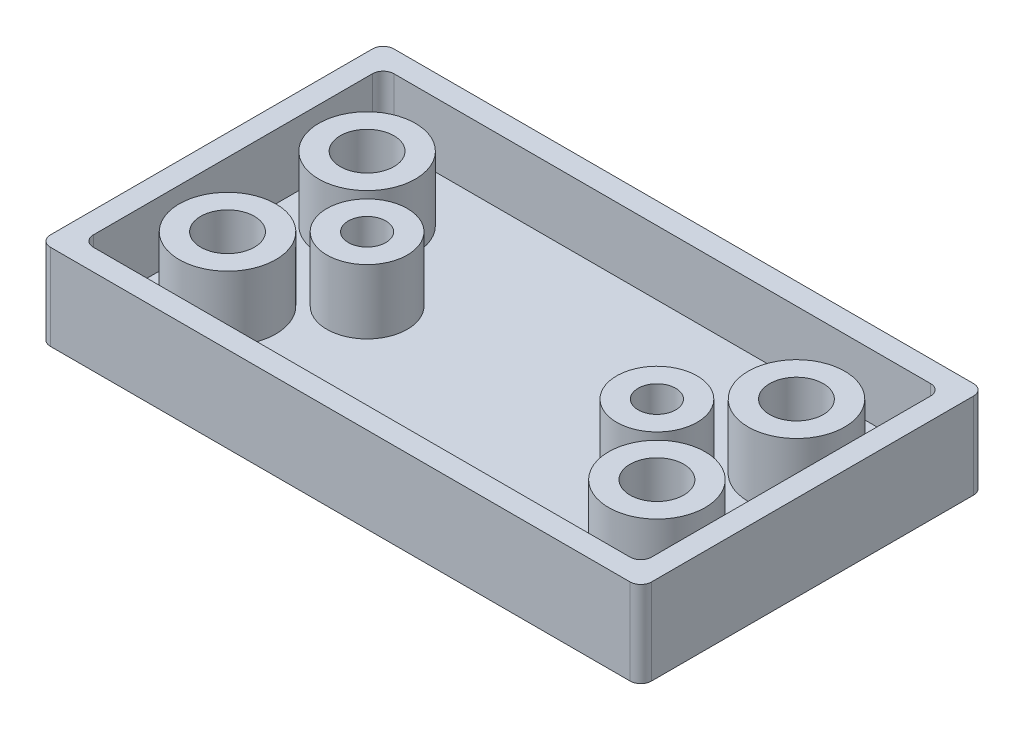
ISO-10303-21;
HEADER;
FILE_DESCRIPTION(('STEP AP214'),'2;1');
FILE_NAME('part.step','',(''),(''),'','','');
FILE_SCHEMA(('AUTOMOTIVE_DESIGN { 1 0 10303 214 1 1 1 1 }'));
ENDSEC;
DATA;
#1=APPLICATION_CONTEXT('core data for automotive mechanical design processes');
#2=APPLICATION_PROTOCOL_DEFINITION('international standard','automotive_design',2000,#1);
#3=PRODUCT_CONTEXT('',#1,'mechanical');
#4=PRODUCT('Part','Part','',(#3));
#5=PRODUCT_RELATED_PRODUCT_CATEGORY('part','',(#4));
#6=PRODUCT_DEFINITION_FORMATION('','',#4);
#7=PRODUCT_DEFINITION_CONTEXT('part definition',#1,'design');
#8=PRODUCT_DEFINITION('design','',#6,#7);
#9=PRODUCT_DEFINITION_SHAPE('','',#8);
#10=(LENGTH_UNIT() NAMED_UNIT(*) SI_UNIT(.MILLI.,.METRE.));
#11=(NAMED_UNIT(*) PLANE_ANGLE_UNIT() SI_UNIT($,.RADIAN.));
#12=(NAMED_UNIT(*) SI_UNIT($,.STERADIAN.) SOLID_ANGLE_UNIT());
#13=UNCERTAINTY_MEASURE_WITH_UNIT(LENGTH_MEASURE(1.E-05),#10,'distance_accuracy_value','');
#14=(GEOMETRIC_REPRESENTATION_CONTEXT(3) GLOBAL_UNCERTAINTY_ASSIGNED_CONTEXT((#13)) GLOBAL_UNIT_ASSIGNED_CONTEXT((#10,
#11,#12)) REPRESENTATION_CONTEXT('',''));
#15=CARTESIAN_POINT('',(0.,0.,0.));
#16=DIRECTION('',(0.,0.,1.));
#17=DIRECTION('',(1.,0.,0.));
#18=AXIS2_PLACEMENT_3D('',#15,#16,#17);
#19=CARTESIAN_POINT('',(0.,8.,0.));
#20=DIRECTION('',(0.,1.,0.));
#21=DIRECTION('',(0.,0.,1.));
#22=AXIS2_PLACEMENT_3D('',#19,#20,#21);
#23=PLANE('',#22);
#24=DIRECTION('',(-1.,0.,0.));
#25=VECTOR('',#24,1.);
#26=CARTESIAN_POINT('',(-28.,8.,-16.));
#27=LINE('',#26,#25);
#28=CARTESIAN_POINT('',(27.,8.,-16.));
#29=VERTEX_POINT('',#28);
#30=CARTESIAN_POINT('',(-27.,8.,-16.));
#31=VERTEX_POINT('',#30);
#32=EDGE_CURVE('E354',#29,#31,#27,.T.);
#33=ORIENTED_EDGE('',*,*,#32,.T.);
#34=CARTESIAN_POINT('',(-27.,8.,-15.));
#35=DIRECTION('',(0.,1.,0.));
#36=DIRECTION('',(0.,0.,1.));
#37=AXIS2_PLACEMENT_3D('',#34,#35,#36);
#38=CIRCLE('',#37,1.);
#39=CARTESIAN_POINT('',(-28.,8.,-15.));
#40=VERTEX_POINT('',#39);
#41=EDGE_CURVE('E246',#31,#40,#38,.T.);
#42=ORIENTED_EDGE('',*,*,#41,.T.);
#43=DIRECTION('',(0.,0.,1.));
#44=VECTOR('',#43,1.);
#45=CARTESIAN_POINT('',(-28.,8.,16.));
#46=LINE('',#45,#44);
#47=CARTESIAN_POINT('',(-28.,8.,15.));
#48=VERTEX_POINT('',#47);
#49=EDGE_CURVE('E175',#40,#48,#46,.T.);
#50=ORIENTED_EDGE('',*,*,#49,.T.);
#51=CARTESIAN_POINT('',(-27.,8.,15.));
#52=DIRECTION('',(0.,1.,0.));
#53=DIRECTION('',(0.,0.,1.));
#54=AXIS2_PLACEMENT_3D('',#51,#52,#53);
#55=CIRCLE('',#54,1.);
#56=CARTESIAN_POINT('',(-27.,8.,16.));
#57=VERTEX_POINT('',#56);
#58=EDGE_CURVE('E237',#48,#57,#55,.T.);
#59=ORIENTED_EDGE('',*,*,#58,.T.);
#60=DIRECTION('',(1.,0.,0.));
#61=VECTOR('',#60,1.);
#62=CARTESIAN_POINT('',(-28.,8.,16.));
#63=LINE('',#62,#61);
#64=CARTESIAN_POINT('',(27.,8.,16.));
#65=VERTEX_POINT('',#64);
#66=EDGE_CURVE('E183',#57,#65,#63,.T.);
#67=ORIENTED_EDGE('',*,*,#66,.T.);
#68=CARTESIAN_POINT('',(27.,8.,15.));
#69=DIRECTION('',(0.,1.,0.));
#70=DIRECTION('',(0.,0.,1.));
#71=AXIS2_PLACEMENT_3D('',#68,#69,#70);
#72=CIRCLE('',#71,1.);
#73=CARTESIAN_POINT('',(28.,8.,15.));
#74=VERTEX_POINT('',#73);
#75=EDGE_CURVE('E240',#65,#74,#72,.T.);
#76=ORIENTED_EDGE('',*,*,#75,.T.);
#77=DIRECTION('',(0.,0.,-1.));
#78=VECTOR('',#77,1.);
#79=CARTESIAN_POINT('',(28.,8.,16.));
#80=LINE('',#79,#78);
#81=CARTESIAN_POINT('',(28.,8.,-15.));
#82=VERTEX_POINT('',#81);
#83=EDGE_CURVE('E189',#74,#82,#80,.T.);
#84=ORIENTED_EDGE('',*,*,#83,.T.);
#85=CARTESIAN_POINT('',(27.,8.,-15.));
#86=DIRECTION('',(0.,1.,0.));
#87=DIRECTION('',(0.,0.,1.));
#88=AXIS2_PLACEMENT_3D('',#85,#86,#87);
#89=CIRCLE('',#88,1.);
#90=EDGE_CURVE('E243',#82,#29,#89,.T.);
#91=ORIENTED_EDGE('',*,*,#90,.T.);
#92=EDGE_LOOP('',(#33,#42,#50,#59,#67,#76,#84,#91));
#93=FACE_BOUND('',#92,.T.);
#94=DIRECTION('',(-1.,0.,0.));
#95=VECTOR('',#94,1.);
#96=CARTESIAN_POINT('',(-26.,8.,-14.));
#97=LINE('',#96,#95);
#98=CARTESIAN_POINT('',(25.,8.,-14.));
#99=VERTEX_POINT('',#98);
#100=CARTESIAN_POINT('',(-25.,8.,-14.));
#101=VERTEX_POINT('',#100);
#102=EDGE_CURVE('E339',#99,#101,#97,.T.);
#103=ORIENTED_EDGE('',*,*,#102,.F.);
#104=CARTESIAN_POINT('',(25.,8.,-13.));
#105=DIRECTION('',(0.,1.,0.));
#106=DIRECTION('',(0.,0.,1.));
#107=AXIS2_PLACEMENT_3D('',#104,#105,#106);
#108=CIRCLE('',#107,1.);
#109=CARTESIAN_POINT('',(26.,8.,-13.));
#110=VERTEX_POINT('',#109);
#111=EDGE_CURVE('E303',#99,#110,#108,.F.);
#112=ORIENTED_EDGE('',*,*,#111,.T.);
#113=DIRECTION('',(0.,0.,-1.));
#114=VECTOR('',#113,1.);
#115=CARTESIAN_POINT('',(26.,8.,14.));
#116=LINE('',#115,#114);
#117=CARTESIAN_POINT('',(26.,8.,13.));
#118=VERTEX_POINT('',#117);
#119=EDGE_CURVE('E315',#118,#110,#116,.T.);
#120=ORIENTED_EDGE('',*,*,#119,.F.);
#121=CARTESIAN_POINT('',(25.,8.,13.));
#122=DIRECTION('',(0.,1.,0.));
#123=DIRECTION('',(0.,0.,1.));
#124=AXIS2_PLACEMENT_3D('',#121,#122,#123);
#125=CIRCLE('',#124,1.);
#126=CARTESIAN_POINT('',(25.,8.,14.));
#127=VERTEX_POINT('',#126);
#128=EDGE_CURVE('E48',#118,#127,#125,.F.);
#129=ORIENTED_EDGE('',*,*,#128,.T.);
#130=DIRECTION('',(1.,0.,0.));
#131=VECTOR('',#130,1.);
#132=CARTESIAN_POINT('',(-26.,8.,14.));
#133=LINE('',#132,#131);
#134=CARTESIAN_POINT('',(-25.,8.,14.));
#135=VERTEX_POINT('',#134);
#136=EDGE_CURVE('E312',#135,#127,#133,.T.);
#137=ORIENTED_EDGE('',*,*,#136,.F.);
#138=CARTESIAN_POINT('',(-25.,8.,13.));
#139=DIRECTION('',(0.,1.,0.));
#140=DIRECTION('',(0.,0.,1.));
#141=AXIS2_PLACEMENT_3D('',#138,#139,#140);
#142=CIRCLE('',#141,1.);
#143=CARTESIAN_POINT('',(-26.,8.,13.));
#144=VERTEX_POINT('',#143);
#145=EDGE_CURVE('E11',#135,#144,#142,.F.);
#146=ORIENTED_EDGE('',*,*,#145,.T.);
#147=DIRECTION('',(0.,0.,1.));
#148=VECTOR('',#147,1.);
#149=CARTESIAN_POINT('',(-26.,8.,14.));
#150=LINE('',#149,#148);
#151=CARTESIAN_POINT('',(-26.,8.,-13.));
#152=VERTEX_POINT('',#151);
#153=EDGE_CURVE('E324',#152,#144,#150,.T.);
#154=ORIENTED_EDGE('',*,*,#153,.F.);
#155=CARTESIAN_POINT('',(-25.,8.,-13.));
#156=DIRECTION('',(0.,1.,0.));
#157=DIRECTION('',(0.,0.,1.));
#158=AXIS2_PLACEMENT_3D('',#155,#156,#157);
#159=CIRCLE('',#158,1.);
#160=EDGE_CURVE('E300',#152,#101,#159,.F.);
#161=ORIENTED_EDGE('',*,*,#160,.T.);
#162=EDGE_LOOP('',(#103,#112,#120,#129,#137,#146,#154,#161));
#163=FACE_BOUND('',#162,.T.);
#164=ADVANCED_FACE('F39',(#93,#163),#23,.T.);
#165=CARTESIAN_POINT('',(0.,0.,0.));
#166=DIRECTION('',(0.,1.,0.));
#167=DIRECTION('',(0.,0.,1.));
#168=AXIS2_PLACEMENT_3D('',#165,#166,#167);
#169=PLANE('',#168);
#170=DIRECTION('',(0.,0.,1.));
#171=VECTOR('',#170,1.);
#172=CARTESIAN_POINT('',(-28.,0.,16.));
#173=LINE('',#172,#171);
#174=CARTESIAN_POINT('',(-28.,0.,-15.));
#175=VERTEX_POINT('',#174);
#176=CARTESIAN_POINT('',(-28.,0.,15.));
#177=VERTEX_POINT('',#176);
#178=EDGE_CURVE('E172',#175,#177,#173,.T.);
#179=ORIENTED_EDGE('',*,*,#178,.F.);
#180=CARTESIAN_POINT('',(-27.,0.,-15.));
#181=DIRECTION('',(0.,1.,0.));
#182=DIRECTION('',(0.,0.,1.));
#183=AXIS2_PLACEMENT_3D('',#180,#181,#182);
#184=CIRCLE('',#183,1.);
#185=CARTESIAN_POINT('',(-27.,0.,-16.));
#186=VERTEX_POINT('',#185);
#187=EDGE_CURVE('E154',#175,#186,#184,.F.);
#188=ORIENTED_EDGE('',*,*,#187,.T.);
#189=DIRECTION('',(-1.,0.,0.));
#190=VECTOR('',#189,1.);
#191=CARTESIAN_POINT('',(-28.,0.,-16.));
#192=LINE('',#191,#190);
#193=CARTESIAN_POINT('',(27.,0.,-16.));
#194=VERTEX_POINT('',#193);
#195=EDGE_CURVE('E184',#194,#186,#192,.T.);
#196=ORIENTED_EDGE('',*,*,#195,.F.);
#197=CARTESIAN_POINT('',(27.,0.,-15.));
#198=DIRECTION('',(0.,1.,0.));
#199=DIRECTION('',(0.,0.,1.));
#200=AXIS2_PLACEMENT_3D('',#197,#198,#199);
#201=CIRCLE('',#200,1.);
#202=CARTESIAN_POINT('',(28.,0.,-15.));
#203=VERTEX_POINT('',#202);
#204=EDGE_CURVE('E166',#194,#203,#201,.F.);
#205=ORIENTED_EDGE('',*,*,#204,.T.);
#206=DIRECTION('',(0.,0.,-1.));
#207=VECTOR('',#206,1.);
#208=CARTESIAN_POINT('',(28.,0.,16.));
#209=LINE('',#208,#207);
#210=CARTESIAN_POINT('',(28.,0.,15.));
#211=VERTEX_POINT('',#210);
#212=EDGE_CURVE('E191',#211,#203,#209,.T.);
#213=ORIENTED_EDGE('',*,*,#212,.F.);
#214=CARTESIAN_POINT('',(27.,0.,15.));
#215=DIRECTION('',(0.,1.,0.));
#216=DIRECTION('',(0.,0.,1.));
#217=AXIS2_PLACEMENT_3D('',#214,#215,#216);
#218=CIRCLE('',#217,1.);
#219=CARTESIAN_POINT('',(27.,0.,16.));
#220=VERTEX_POINT('',#219);
#221=EDGE_CURVE('E227',#211,#220,#218,.F.);
#222=ORIENTED_EDGE('',*,*,#221,.T.);
#223=DIRECTION('',(1.,0.,0.));
#224=VECTOR('',#223,1.);
#225=CARTESIAN_POINT('',(-28.,0.,16.));
#226=LINE('',#225,#224);
#227=CARTESIAN_POINT('',(-27.,0.,16.));
#228=VERTEX_POINT('',#227);
#229=EDGE_CURVE('E323',#228,#220,#226,.T.);
#230=ORIENTED_EDGE('',*,*,#229,.F.);
#231=CARTESIAN_POINT('',(-27.,0.,15.));
#232=DIRECTION('',(0.,1.,0.));
#233=DIRECTION('',(0.,0.,1.));
#234=AXIS2_PLACEMENT_3D('',#231,#232,#233);
#235=CIRCLE('',#234,1.);
#236=EDGE_CURVE('E177',#228,#177,#235,.F.);
#237=ORIENTED_EDGE('',*,*,#236,.T.);
#238=EDGE_LOOP('',(#179,#188,#196,#205,#213,#222,#230,#237));
#239=FACE_BOUND('',#238,.T.);
#240=ADVANCED_FACE('F180',(#239),#169,.F.);
#241=CARTESIAN_POINT('',(-28.,8.,16.));
#242=DIRECTION('',(0.,0.,-1.));
#243=DIRECTION('',(-1.,0.,0.));
#244=AXIS2_PLACEMENT_3D('',#241,#242,#243);
#245=PLANE('',#244);
#246=ORIENTED_EDGE('',*,*,#229,.T.);
#247=DIRECTION('',(0.,-1.,0.));
#248=VECTOR('',#247,1.);
#249=CARTESIAN_POINT('',(27.,8.,16.));
#250=LINE('',#249,#248);
#251=EDGE_CURVE('E297',#220,#65,#250,.F.);
#252=ORIENTED_EDGE('',*,*,#251,.T.);
#253=ORIENTED_EDGE('',*,*,#66,.F.);
#254=DIRECTION('',(0.,-1.,0.));
#255=VECTOR('',#254,1.);
#256=CARTESIAN_POINT('',(-27.,8.,16.));
#257=LINE('',#256,#255);
#258=EDGE_CURVE('E293',#57,#228,#257,.T.);
#259=ORIENTED_EDGE('',*,*,#258,.T.);
#260=EDGE_LOOP('',(#246,#252,#253,#259));
#261=FACE_BOUND('',#260,.T.);
#262=ADVANCED_FACE('F385',(#261),#245,.F.);
#263=CARTESIAN_POINT('',(28.,8.,16.));
#264=DIRECTION('',(-1.,0.,0.));
#265=DIRECTION('',(0.,0.,1.));
#266=AXIS2_PLACEMENT_3D('',#263,#264,#265);
#267=PLANE('',#266);
#268=ORIENTED_EDGE('',*,*,#212,.T.);
#269=DIRECTION('',(0.,-1.,0.));
#270=VECTOR('',#269,1.);
#271=CARTESIAN_POINT('',(28.,8.,-15.));
#272=LINE('',#271,#270);
#273=EDGE_CURVE('E276',#203,#82,#272,.F.);
#274=ORIENTED_EDGE('',*,*,#273,.T.);
#275=ORIENTED_EDGE('',*,*,#83,.F.);
#276=DIRECTION('',(0.,-1.,0.));
#277=VECTOR('',#276,1.);
#278=CARTESIAN_POINT('',(28.,8.,15.));
#279=LINE('',#278,#277);
#280=EDGE_CURVE('E272',#74,#211,#279,.T.);
#281=ORIENTED_EDGE('',*,*,#280,.T.);
#282=EDGE_LOOP('',(#268,#274,#275,#281));
#283=FACE_BOUND('',#282,.T.);
#284=ADVANCED_FACE('F367',(#283),#267,.F.);
#285=CARTESIAN_POINT('',(-28.,8.,-16.));
#286=DIRECTION('',(0.,0.,1.));
#287=DIRECTION('',(1.,0.,0.));
#288=AXIS2_PLACEMENT_3D('',#285,#286,#287);
#289=PLANE('',#288);
#290=ORIENTED_EDGE('',*,*,#195,.T.);
#291=DIRECTION('',(0.,-1.,0.));
#292=VECTOR('',#291,1.);
#293=CARTESIAN_POINT('',(-27.,8.,-16.));
#294=LINE('',#293,#292);
#295=EDGE_CURVE('E159',#186,#31,#294,.F.);
#296=ORIENTED_EDGE('',*,*,#295,.T.);
#297=ORIENTED_EDGE('',*,*,#32,.F.);
#298=DIRECTION('',(0.,-1.,0.));
#299=VECTOR('',#298,1.);
#300=CARTESIAN_POINT('',(27.,8.,-16.));
#301=LINE('',#300,#299);
#302=EDGE_CURVE('E165',#29,#194,#301,.T.);
#303=ORIENTED_EDGE('',*,*,#302,.T.);
#304=EDGE_LOOP('',(#290,#296,#297,#303));
#305=FACE_BOUND('',#304,.T.);
#306=ADVANCED_FACE('F377',(#305),#289,.F.);
#307=CARTESIAN_POINT('',(-28.,8.,16.));
#308=DIRECTION('',(1.,0.,0.));
#309=DIRECTION('',(0.,0.,-1.));
#310=AXIS2_PLACEMENT_3D('',#307,#308,#309);
#311=PLANE('',#310);
#312=ORIENTED_EDGE('',*,*,#49,.F.);
#313=DIRECTION('',(0.,-1.,0.));
#314=VECTOR('',#313,1.);
#315=CARTESIAN_POINT('',(-28.,8.,-15.));
#316=LINE('',#315,#314);
#317=EDGE_CURVE('E158',#40,#175,#316,.T.);
#318=ORIENTED_EDGE('',*,*,#317,.T.);
#319=ORIENTED_EDGE('',*,*,#178,.T.);
#320=DIRECTION('',(0.,-1.,0.));
#321=VECTOR('',#320,1.);
#322=CARTESIAN_POINT('',(-28.,8.,15.));
#323=LINE('',#322,#321);
#324=EDGE_CURVE('E178',#177,#48,#323,.F.);
#325=ORIENTED_EDGE('',*,*,#324,.T.);
#326=EDGE_LOOP('',(#312,#318,#319,#325));
#327=FACE_BOUND('',#326,.T.);
#328=ADVANCED_FACE('F171',(#327),#311,.F.);
#329=CARTESIAN_POINT('',(26.,8.,14.));
#330=DIRECTION('',(-1.,0.,0.));
#331=DIRECTION('',(0.,0.,1.));
#332=AXIS2_PLACEMENT_3D('',#329,#330,#331);
#333=PLANE('',#332);
#334=ORIENTED_EDGE('',*,*,#119,.T.);
#335=DIRECTION('',(0.,-1.,0.));
#336=VECTOR('',#335,1.);
#337=CARTESIAN_POINT('',(26.,2.,-13.));
#338=LINE('',#337,#336);
#339=CARTESIAN_POINT('',(26.,2.,-13.));
#340=VERTEX_POINT('',#339);
#341=EDGE_CURVE('E282',#110,#340,#338,.T.);
#342=ORIENTED_EDGE('',*,*,#341,.T.);
#343=DIRECTION('',(0.,0.,-1.));
#344=VECTOR('',#343,1.);
#345=CARTESIAN_POINT('',(26.,2.,14.));
#346=LINE('',#345,#344);
#347=CARTESIAN_POINT('',(26.,2.,13.));
#348=VERTEX_POINT('',#347);
#349=EDGE_CURVE('E330',#348,#340,#346,.T.);
#350=ORIENTED_EDGE('',*,*,#349,.F.);
#351=DIRECTION('',(0.,-1.,0.));
#352=VECTOR('',#351,1.);
#353=CARTESIAN_POINT('',(26.,8.,13.));
#354=LINE('',#353,#352);
#355=EDGE_CURVE('E279',#348,#118,#354,.F.);
#356=ORIENTED_EDGE('',*,*,#355,.T.);
#357=EDGE_LOOP('',(#334,#342,#350,#356));
#358=FACE_BOUND('',#357,.T.);
#359=ADVANCED_FACE('F332',(#358),#333,.T.);
#360=CARTESIAN_POINT('',(-26.,8.,-14.));
#361=DIRECTION('',(0.,0.,1.));
#362=DIRECTION('',(1.,0.,0.));
#363=AXIS2_PLACEMENT_3D('',#360,#361,#362);
#364=PLANE('',#363);
#365=ORIENTED_EDGE('',*,*,#102,.T.);
#366=DIRECTION('',(0.,-1.,0.));
#367=VECTOR('',#366,1.);
#368=CARTESIAN_POINT('',(-25.,2.,-14.));
#369=LINE('',#368,#367);
#370=CARTESIAN_POINT('',(-25.,2.,-14.));
#371=VERTEX_POINT('',#370);
#372=EDGE_CURVE('E252',#101,#371,#369,.T.);
#373=ORIENTED_EDGE('',*,*,#372,.T.);
#374=DIRECTION('',(-1.,0.,0.));
#375=VECTOR('',#374,1.);
#376=CARTESIAN_POINT('',(-26.,2.,-14.));
#377=LINE('',#376,#375);
#378=CARTESIAN_POINT('',(25.,2.,-14.));
#379=VERTEX_POINT('',#378);
#380=EDGE_CURVE('E335',#379,#371,#377,.T.);
#381=ORIENTED_EDGE('',*,*,#380,.F.);
#382=DIRECTION('',(0.,-1.,0.));
#383=VECTOR('',#382,1.);
#384=CARTESIAN_POINT('',(25.,8.,-14.));
#385=LINE('',#384,#383);
#386=EDGE_CURVE('E249',#379,#99,#385,.F.);
#387=ORIENTED_EDGE('',*,*,#386,.T.);
#388=EDGE_LOOP('',(#365,#373,#381,#387));
#389=FACE_BOUND('',#388,.T.);
#390=ADVANCED_FACE('F396',(#389),#364,.T.);
#391=CARTESIAN_POINT('',(-26.,8.,14.));
#392=DIRECTION('',(1.,0.,0.));
#393=DIRECTION('',(0.,0.,-1.));
#394=AXIS2_PLACEMENT_3D('',#391,#392,#393);
#395=PLANE('',#394);
#396=DIRECTION('',(0.,0.,1.));
#397=VECTOR('',#396,1.);
#398=CARTESIAN_POINT('',(-26.,2.,14.));
#399=LINE('',#398,#397);
#400=CARTESIAN_POINT('',(-26.,2.,-13.));
#401=VERTEX_POINT('',#400);
#402=CARTESIAN_POINT('',(-26.,2.,13.));
#403=VERTEX_POINT('',#402);
#404=EDGE_CURVE('E341',#401,#403,#399,.T.);
#405=ORIENTED_EDGE('',*,*,#404,.F.);
#406=DIRECTION('',(0.,-1.,0.));
#407=VECTOR('',#406,1.);
#408=CARTESIAN_POINT('',(-26.,8.,-13.));
#409=LINE('',#408,#407);
#410=EDGE_CURVE('E269',#401,#152,#409,.F.);
#411=ORIENTED_EDGE('',*,*,#410,.T.);
#412=ORIENTED_EDGE('',*,*,#153,.T.);
#413=DIRECTION('',(0.,-1.,0.));
#414=VECTOR('',#413,1.);
#415=CARTESIAN_POINT('',(-26.,2.,13.));
#416=LINE('',#415,#414);
#417=EDGE_CURVE('E266',#144,#403,#416,.T.);
#418=ORIENTED_EDGE('',*,*,#417,.T.);
#419=EDGE_LOOP('',(#405,#411,#412,#418));
#420=FACE_BOUND('',#419,.T.);
#421=ADVANCED_FACE('F399',(#420),#395,.T.);
#422=CARTESIAN_POINT('',(-26.,8.,14.));
#423=DIRECTION('',(0.,0.,-1.));
#424=DIRECTION('',(-1.,0.,0.));
#425=AXIS2_PLACEMENT_3D('',#422,#423,#424);
#426=PLANE('',#425);
#427=ORIENTED_EDGE('',*,*,#136,.T.);
#428=DIRECTION('',(0.,-1.,0.));
#429=VECTOR('',#428,1.);
#430=CARTESIAN_POINT('',(25.,2.,14.));
#431=LINE('',#430,#429);
#432=CARTESIAN_POINT('',(25.,2.,14.));
#433=VERTEX_POINT('',#432);
#434=EDGE_CURVE('E289',#127,#433,#431,.T.);
#435=ORIENTED_EDGE('',*,*,#434,.T.);
#436=DIRECTION('',(1.,0.,0.));
#437=VECTOR('',#436,1.);
#438=CARTESIAN_POINT('',(-26.,2.,14.));
#439=LINE('',#438,#437);
#440=CARTESIAN_POINT('',(-25.,2.,14.));
#441=VERTEX_POINT('',#440);
#442=EDGE_CURVE('E195',#441,#433,#439,.T.);
#443=ORIENTED_EDGE('',*,*,#442,.F.);
#444=DIRECTION('',(0.,-1.,0.));
#445=VECTOR('',#444,1.);
#446=CARTESIAN_POINT('',(-25.,8.,14.));
#447=LINE('',#446,#445);
#448=EDGE_CURVE('E286',#441,#135,#447,.F.);
#449=ORIENTED_EDGE('',*,*,#448,.T.);
#450=EDGE_LOOP('',(#427,#435,#443,#449));
#451=FACE_BOUND('',#450,.T.);
#452=ADVANCED_FACE('F320',(#451),#426,.T.);
#453=CARTESIAN_POINT('',(0.,2.,0.));
#454=DIRECTION('',(0.,1.,0.));
#455=DIRECTION('',(0.,0.,1.));
#456=AXIS2_PLACEMENT_3D('',#453,#454,#455);
#457=PLANE('',#456);
#458=CARTESIAN_POINT('',(-20.,2.,-6.5));
#459=DIRECTION('',(0.,1.,0.));
#460=DIRECTION('',(0.,0.,1.));
#461=AXIS2_PLACEMENT_3D('',#458,#459,#460);
#462=CIRCLE('',#461,4.5);
#463=CARTESIAN_POINT('',(-20.,2.,-2.));
#464=VERTEX_POINT('',#463);
#465=EDGE_CURVE('E219',#464,#464,#462,.T.);
#466=ORIENTED_EDGE('',*,*,#465,.F.);
#467=EDGE_LOOP('',(#466));
#468=FACE_BOUND('',#467,.T.);
#469=CARTESIAN_POINT('',(-20.,2.,6.5));
#470=DIRECTION('',(0.,1.,0.));
#471=DIRECTION('',(0.,0.,-1.));
#472=AXIS2_PLACEMENT_3D('',#469,#470,#471);
#473=CIRCLE('',#472,4.5);
#474=CARTESIAN_POINT('',(-20.,2.,2.));
#475=VERTEX_POINT('',#474);
#476=EDGE_CURVE('E510',#475,#475,#473,.T.);
#477=ORIENTED_EDGE('',*,*,#476,.F.);
#478=EDGE_LOOP('',(#477));
#479=FACE_BOUND('',#478,.T.);
#480=CARTESIAN_POINT('',(-13.5,2.,0.));
#481=DIRECTION('',(0.,1.,0.));
#482=DIRECTION('',(0.,0.,-1.));
#483=AXIS2_PLACEMENT_3D('',#480,#481,#482);
#484=CIRCLE('',#483,3.75);
#485=CARTESIAN_POINT('',(-13.5,2.,-3.75));
#486=VERTEX_POINT('',#485);
#487=EDGE_CURVE('E522',#486,#486,#484,.T.);
#488=ORIENTED_EDGE('',*,*,#487,.F.);
#489=EDGE_LOOP('',(#488));
#490=FACE_BOUND('',#489,.T.);
#491=CARTESIAN_POINT('',(20.,2.,6.5));
#492=DIRECTION('',(0.,1.,0.));
#493=DIRECTION('',(0.,0.,1.));
#494=AXIS2_PLACEMENT_3D('',#491,#492,#493);
#495=CIRCLE('',#494,4.5);
#496=CARTESIAN_POINT('',(20.,2.,11.));
#497=VERTEX_POINT('',#496);
#498=EDGE_CURVE('E207',#497,#497,#495,.T.);
#499=ORIENTED_EDGE('',*,*,#498,.F.);
#500=EDGE_LOOP('',(#499));
#501=FACE_BOUND('',#500,.T.);
#502=CARTESIAN_POINT('',(20.,2.,-6.5));
#503=DIRECTION('',(0.,1.,0.));
#504=DIRECTION('',(0.,0.,1.));
#505=AXIS2_PLACEMENT_3D('',#502,#503,#504);
#506=CIRCLE('',#505,4.5);
#507=CARTESIAN_POINT('',(20.,2.,-2.));
#508=VERTEX_POINT('',#507);
#509=EDGE_CURVE('E546',#508,#508,#506,.T.);
#510=ORIENTED_EDGE('',*,*,#509,.F.);
#511=EDGE_LOOP('',(#510));
#512=FACE_BOUND('',#511,.T.);
#513=CARTESIAN_POINT('',(13.5,2.,0.));
#514=DIRECTION('',(0.,1.,0.));
#515=DIRECTION('',(0.,0.,1.));
#516=AXIS2_PLACEMENT_3D('',#513,#514,#515);
#517=CIRCLE('',#516,3.75);
#518=CARTESIAN_POINT('',(13.5,2.,3.75));
#519=VERTEX_POINT('',#518);
#520=EDGE_CURVE('E558',#519,#519,#517,.T.);
#521=ORIENTED_EDGE('',*,*,#520,.F.);
#522=EDGE_LOOP('',(#521));
#523=FACE_BOUND('',#522,.T.);
#524=ORIENTED_EDGE('',*,*,#380,.T.);
#525=CARTESIAN_POINT('',(-25.,2.,-13.));
#526=DIRECTION('',(0.,1.,0.));
#527=DIRECTION('',(0.,0.,1.));
#528=AXIS2_PLACEMENT_3D('',#525,#526,#527);
#529=CIRCLE('',#528,1.);
#530=EDGE_CURVE('E63',#371,#401,#529,.T.);
#531=ORIENTED_EDGE('',*,*,#530,.T.);
#532=ORIENTED_EDGE('',*,*,#404,.T.);
#533=CARTESIAN_POINT('',(-25.,2.,13.));
#534=DIRECTION('',(0.,1.,0.));
#535=DIRECTION('',(0.,0.,1.));
#536=AXIS2_PLACEMENT_3D('',#533,#534,#535);
#537=CIRCLE('',#536,1.);
#538=EDGE_CURVE('E55',#403,#441,#537,.T.);
#539=ORIENTED_EDGE('',*,*,#538,.T.);
#540=ORIENTED_EDGE('',*,*,#442,.T.);
#541=CARTESIAN_POINT('',(25.,2.,13.));
#542=DIRECTION('',(0.,1.,0.));
#543=DIRECTION('',(0.,0.,1.));
#544=AXIS2_PLACEMENT_3D('',#541,#542,#543);
#545=CIRCLE('',#544,1.);
#546=EDGE_CURVE('E258',#433,#348,#545,.T.);
#547=ORIENTED_EDGE('',*,*,#546,.T.);
#548=ORIENTED_EDGE('',*,*,#349,.T.);
#549=CARTESIAN_POINT('',(25.,2.,-13.));
#550=DIRECTION('',(0.,1.,0.));
#551=DIRECTION('',(0.,0.,1.));
#552=AXIS2_PLACEMENT_3D('',#549,#550,#551);
#553=CIRCLE('',#552,1.);
#554=EDGE_CURVE('E261',#340,#379,#553,.T.);
#555=ORIENTED_EDGE('',*,*,#554,.T.);
#556=EDGE_LOOP('',(#524,#531,#532,#539,#540,#547,#548,#555));
#557=FACE_BOUND('',#556,.T.);
#558=ADVANCED_FACE('F329',(#468,#479,#490,#501,#512,#523,#557),#457,.T.);
#559=CARTESIAN_POINT('',(13.5,8.,0.));
#560=DIRECTION('',(0.,1.,0.));
#561=DIRECTION('',(0.,0.,1.));
#562=AXIS2_PLACEMENT_3D('',#559,#560,#561);
#563=PLANE('',#562);
#564=CARTESIAN_POINT('',(13.5,8.,0.));
#565=DIRECTION('',(0.,1.,0.));
#566=DIRECTION('',(0.,0.,1.));
#567=AXIS2_PLACEMENT_3D('',#564,#565,#566);
#568=CIRCLE('',#567,3.75);
#569=CARTESIAN_POINT('',(13.5,8.,3.75));
#570=VERTEX_POINT('',#569);
#571=EDGE_CURVE('E559',#570,#570,#568,.T.);
#572=ORIENTED_EDGE('',*,*,#571,.T.);
#573=EDGE_LOOP('',(#572));
#574=FACE_BOUND('',#573,.T.);
#575=CARTESIAN_POINT('',(13.5,8.,0.));
#576=DIRECTION('',(0.,1.,0.));
#577=DIRECTION('',(0.,0.,1.));
#578=AXIS2_PLACEMENT_3D('',#575,#576,#577);
#579=CIRCLE('',#578,1.75);
#580=CARTESIAN_POINT('',(13.5,8.,1.75));
#581=VERTEX_POINT('',#580);
#582=EDGE_CURVE('E551',#581,#581,#579,.T.);
#583=ORIENTED_EDGE('',*,*,#582,.F.);
#584=EDGE_LOOP('',(#583));
#585=FACE_BOUND('',#584,.T.);
#586=ADVANCED_FACE('F408',(#574,#585),#563,.T.);
#587=CARTESIAN_POINT('',(13.5,8.,0.));
#588=DIRECTION('',(0.,-1.,0.));
#589=DIRECTION('',(0.,0.,-1.));
#590=AXIS2_PLACEMENT_3D('',#587,#588,#589);
#591=CYLINDRICAL_SURFACE('',#590,3.75);
#592=ORIENTED_EDGE('',*,*,#571,.F.);
#593=EDGE_LOOP('',(#592));
#594=FACE_BOUND('',#593,.T.);
#595=ORIENTED_EDGE('',*,*,#520,.T.);
#596=EDGE_LOOP('',(#595));
#597=FACE_BOUND('',#596,.T.);
#598=ADVANCED_FACE('F412',(#594,#597),#591,.T.);
#599=CARTESIAN_POINT('',(13.5,8.,0.));
#600=DIRECTION('',(0.,-1.,0.));
#601=DIRECTION('',(0.,0.,-1.));
#602=AXIS2_PLACEMENT_3D('',#599,#600,#601);
#603=CYLINDRICAL_SURFACE('',#602,1.75);
#604=ORIENTED_EDGE('',*,*,#582,.T.);
#605=EDGE_LOOP('',(#604));
#606=FACE_BOUND('',#605,.T.);
#607=CARTESIAN_POINT('',(13.5,2.,0.));
#608=DIRECTION('',(0.,1.,0.));
#609=DIRECTION('',(0.,0.,1.));
#610=AXIS2_PLACEMENT_3D('',#607,#608,#609);
#611=CIRCLE('',#610,1.75);
#612=CARTESIAN_POINT('',(13.5,2.,1.75));
#613=VERTEX_POINT('',#612);
#614=EDGE_CURVE('E199',#613,#613,#611,.F.);
#615=ORIENTED_EDGE('',*,*,#614,.T.);
#616=EDGE_LOOP('',(#615));
#617=FACE_BOUND('',#616,.T.);
#618=ADVANCED_FACE('F415',(#606,#617),#603,.F.);
#619=ORIENTED_EDGE('',*,*,#614,.F.);
#620=EDGE_LOOP('',(#619));
#621=FACE_BOUND('',#620,.T.);
#622=ADVANCED_FACE('F411',(#621),#457,.T.);
#623=CARTESIAN_POINT('',(20.,8.,-6.5));
#624=DIRECTION('',(0.,1.,0.));
#625=DIRECTION('',(0.,0.,1.));
#626=AXIS2_PLACEMENT_3D('',#623,#624,#625);
#627=PLANE('',#626);
#628=CARTESIAN_POINT('',(20.,8.,-6.5));
#629=DIRECTION('',(0.,1.,0.));
#630=DIRECTION('',(0.,0.,1.));
#631=AXIS2_PLACEMENT_3D('',#628,#629,#630);
#632=CIRCLE('',#631,4.5);
#633=CARTESIAN_POINT('',(20.,8.,-2.));
#634=VERTEX_POINT('',#633);
#635=EDGE_CURVE('E547',#634,#634,#632,.T.);
#636=ORIENTED_EDGE('',*,*,#635,.T.);
#637=EDGE_LOOP('',(#636));
#638=FACE_BOUND('',#637,.T.);
#639=CARTESIAN_POINT('',(20.,8.,-6.5));
#640=DIRECTION('',(0.,1.,0.));
#641=DIRECTION('',(0.,0.,1.));
#642=AXIS2_PLACEMENT_3D('',#639,#640,#641);
#643=CIRCLE('',#642,2.5);
#644=CARTESIAN_POINT('',(20.,8.,-4.));
#645=VERTEX_POINT('',#644);
#646=EDGE_CURVE('E542',#645,#645,#643,.T.);
#647=ORIENTED_EDGE('',*,*,#646,.F.);
#648=EDGE_LOOP('',(#647));
#649=FACE_BOUND('',#648,.T.);
#650=ADVANCED_FACE('F427',(#638,#649),#627,.T.);
#651=CARTESIAN_POINT('',(20.,8.,-6.5));
#652=DIRECTION('',(0.,-1.,0.));
#653=DIRECTION('',(0.,0.,-1.));
#654=AXIS2_PLACEMENT_3D('',#651,#652,#653);
#655=CYLINDRICAL_SURFACE('',#654,4.5);
#656=ORIENTED_EDGE('',*,*,#635,.F.);
#657=EDGE_LOOP('',(#656));
#658=FACE_BOUND('',#657,.T.);
#659=ORIENTED_EDGE('',*,*,#509,.T.);
#660=EDGE_LOOP('',(#659));
#661=FACE_BOUND('',#660,.T.);
#662=ADVANCED_FACE('F423',(#658,#661),#655,.T.);
#663=CARTESIAN_POINT('',(20.,8.,-6.5));
#664=DIRECTION('',(0.,-1.,0.));
#665=DIRECTION('',(0.,0.,-1.));
#666=AXIS2_PLACEMENT_3D('',#663,#664,#665);
#667=CYLINDRICAL_SURFACE('',#666,2.5);
#668=ORIENTED_EDGE('',*,*,#646,.T.);
#669=EDGE_LOOP('',(#668));
#670=FACE_BOUND('',#669,.T.);
#671=CARTESIAN_POINT('',(20.,2.,-6.5));
#672=DIRECTION('',(0.,1.,0.));
#673=DIRECTION('',(0.,0.,1.));
#674=AXIS2_PLACEMENT_3D('',#671,#672,#673);
#675=CIRCLE('',#674,2.5);
#676=CARTESIAN_POINT('',(20.,2.,-4.));
#677=VERTEX_POINT('',#676);
#678=EDGE_CURVE('E203',#677,#677,#675,.F.);
#679=ORIENTED_EDGE('',*,*,#678,.T.);
#680=EDGE_LOOP('',(#679));
#681=FACE_BOUND('',#680,.T.);
#682=ADVANCED_FACE('F426',(#670,#681),#667,.F.);
#683=ORIENTED_EDGE('',*,*,#678,.F.);
#684=EDGE_LOOP('',(#683));
#685=FACE_BOUND('',#684,.T.);
#686=ADVANCED_FACE('F434',(#685),#457,.T.);
#687=CARTESIAN_POINT('',(20.,8.,6.5));
#688=DIRECTION('',(0.,-1.,0.));
#689=DIRECTION('',(0.,0.,-1.));
#690=AXIS2_PLACEMENT_3D('',#687,#688,#689);
#691=CYLINDRICAL_SURFACE('',#690,4.5);
#692=CARTESIAN_POINT('',(20.,8.,6.5));
#693=DIRECTION('',(0.,-1.,0.));
#694=DIRECTION('',(0.,0.,-1.));
#695=AXIS2_PLACEMENT_3D('',#692,#693,#694);
#696=CIRCLE('',#695,4.5);
#697=CARTESIAN_POINT('',(20.,8.,2.));
#698=VERTEX_POINT('',#697);
#699=EDGE_CURVE('E535',#698,#698,#696,.T.);
#700=ORIENTED_EDGE('',*,*,#699,.T.);
#701=EDGE_LOOP('',(#700));
#702=FACE_BOUND('',#701,.T.);
#703=ORIENTED_EDGE('',*,*,#498,.T.);
#704=EDGE_LOOP('',(#703));
#705=FACE_BOUND('',#704,.T.);
#706=ADVANCED_FACE('F436',(#702,#705),#691,.T.);
#707=CARTESIAN_POINT('',(20.,8.,6.5));
#708=DIRECTION('',(0.,1.,0.));
#709=DIRECTION('',(0.,0.,-1.));
#710=AXIS2_PLACEMENT_3D('',#707,#708,#709);
#711=PLANE('',#710);
#712=CARTESIAN_POINT('',(20.,8.,6.5));
#713=DIRECTION('',(0.,-1.,0.));
#714=DIRECTION('',(0.,0.,-1.));
#715=AXIS2_PLACEMENT_3D('',#712,#713,#714);
#716=CIRCLE('',#715,2.5);
#717=CARTESIAN_POINT('',(20.,8.,4.));
#718=VERTEX_POINT('',#717);
#719=EDGE_CURVE('E531',#718,#718,#716,.T.);
#720=ORIENTED_EDGE('',*,*,#719,.T.);
#721=EDGE_LOOP('',(#720));
#722=FACE_BOUND('',#721,.T.);
#723=ORIENTED_EDGE('',*,*,#699,.F.);
#724=EDGE_LOOP('',(#723));
#725=FACE_BOUND('',#724,.T.);
#726=ADVANCED_FACE('F439',(#722,#725),#711,.T.);
#727=CARTESIAN_POINT('',(20.,8.,6.5));
#728=DIRECTION('',(0.,-1.,0.));
#729=DIRECTION('',(0.,0.,-1.));
#730=AXIS2_PLACEMENT_3D('',#727,#728,#729);
#731=CYLINDRICAL_SURFACE('',#730,2.5);
#732=ORIENTED_EDGE('',*,*,#719,.F.);
#733=EDGE_LOOP('',(#732));
#734=FACE_BOUND('',#733,.T.);
#735=CARTESIAN_POINT('',(20.,2.,6.5));
#736=DIRECTION('',(0.,-1.,0.));
#737=DIRECTION('',(0.,0.,-1.));
#738=AXIS2_PLACEMENT_3D('',#735,#736,#737);
#739=CIRCLE('',#738,2.5);
#740=CARTESIAN_POINT('',(20.,2.,4.));
#741=VERTEX_POINT('',#740);
#742=EDGE_CURVE('E527',#741,#741,#739,.T.);
#743=ORIENTED_EDGE('',*,*,#742,.T.);
#744=EDGE_LOOP('',(#743));
#745=FACE_BOUND('',#744,.T.);
#746=ADVANCED_FACE('F443',(#734,#745),#731,.F.);
#747=ORIENTED_EDGE('',*,*,#742,.F.);
#748=EDGE_LOOP('',(#747));
#749=FACE_BOUND('',#748,.T.);
#750=ADVANCED_FACE('F447',(#749),#457,.T.);
#751=CARTESIAN_POINT('',(-13.5,8.,0.));
#752=DIRECTION('',(0.,1.,0.));
#753=DIRECTION('',(0.,0.,-1.));
#754=AXIS2_PLACEMENT_3D('',#751,#752,#753);
#755=PLANE('',#754);
#756=CARTESIAN_POINT('',(-13.5,8.,0.));
#757=DIRECTION('',(0.,1.,0.));
#758=DIRECTION('',(0.,0.,-1.));
#759=AXIS2_PLACEMENT_3D('',#756,#757,#758);
#760=CIRCLE('',#759,3.75);
#761=CARTESIAN_POINT('',(-13.5,8.,-3.75));
#762=VERTEX_POINT('',#761);
#763=EDGE_CURVE('E523',#762,#762,#760,.T.);
#764=ORIENTED_EDGE('',*,*,#763,.T.);
#765=EDGE_LOOP('',(#764));
#766=FACE_BOUND('',#765,.T.);
#767=CARTESIAN_POINT('',(-13.5,8.,0.));
#768=DIRECTION('',(0.,1.,0.));
#769=DIRECTION('',(0.,0.,-1.));
#770=AXIS2_PLACEMENT_3D('',#767,#768,#769);
#771=CIRCLE('',#770,1.75);
#772=CARTESIAN_POINT('',(-13.5,8.,-1.75));
#773=VERTEX_POINT('',#772);
#774=EDGE_CURVE('E515',#773,#773,#771,.T.);
#775=ORIENTED_EDGE('',*,*,#774,.F.);
#776=EDGE_LOOP('',(#775));
#777=FACE_BOUND('',#776,.T.);
#778=ADVANCED_FACE('F453',(#766,#777),#755,.T.);
#779=CARTESIAN_POINT('',(-13.5,8.,0.));
#780=DIRECTION('',(0.,-1.,0.));
#781=DIRECTION('',(0.,0.,-1.));
#782=AXIS2_PLACEMENT_3D('',#779,#780,#781);
#783=CYLINDRICAL_SURFACE('',#782,3.75);
#784=ORIENTED_EDGE('',*,*,#763,.F.);
#785=EDGE_LOOP('',(#784));
#786=FACE_BOUND('',#785,.T.);
#787=ORIENTED_EDGE('',*,*,#487,.T.);
#788=EDGE_LOOP('',(#787));
#789=FACE_BOUND('',#788,.T.);
#790=ADVANCED_FACE('F449',(#786,#789),#783,.T.);
#791=CARTESIAN_POINT('',(-13.5,8.,0.));
#792=DIRECTION('',(0.,-1.,0.));
#793=DIRECTION('',(0.,0.,-1.));
#794=AXIS2_PLACEMENT_3D('',#791,#792,#793);
#795=CYLINDRICAL_SURFACE('',#794,1.75);
#796=ORIENTED_EDGE('',*,*,#774,.T.);
#797=EDGE_LOOP('',(#796));
#798=FACE_BOUND('',#797,.T.);
#799=CARTESIAN_POINT('',(-13.5,2.,0.));
#800=DIRECTION('',(0.,1.,0.));
#801=DIRECTION('',(0.,0.,1.));
#802=AXIS2_PLACEMENT_3D('',#799,#800,#801);
#803=CIRCLE('',#802,1.75);
#804=CARTESIAN_POINT('',(-13.5,2.,1.75));
#805=VERTEX_POINT('',#804);
#806=EDGE_CURVE('E211',#805,#805,#803,.F.);
#807=ORIENTED_EDGE('',*,*,#806,.T.);
#808=EDGE_LOOP('',(#807));
#809=FACE_BOUND('',#808,.T.);
#810=ADVANCED_FACE('F452',(#798,#809),#795,.F.);
#811=ORIENTED_EDGE('',*,*,#806,.F.);
#812=EDGE_LOOP('',(#811));
#813=FACE_BOUND('',#812,.T.);
#814=ADVANCED_FACE('F460',(#813),#457,.T.);
#815=CARTESIAN_POINT('',(-20.,8.,6.5));
#816=DIRECTION('',(0.,1.,0.));
#817=DIRECTION('',(0.,0.,-1.));
#818=AXIS2_PLACEMENT_3D('',#815,#816,#817);
#819=PLANE('',#818);
#820=CARTESIAN_POINT('',(-20.,8.,6.5));
#821=DIRECTION('',(0.,1.,0.));
#822=DIRECTION('',(0.,0.,-1.));
#823=AXIS2_PLACEMENT_3D('',#820,#821,#822);
#824=CIRCLE('',#823,4.5);
#825=CARTESIAN_POINT('',(-20.,8.,2.));
#826=VERTEX_POINT('',#825);
#827=EDGE_CURVE('E511',#826,#826,#824,.T.);
#828=ORIENTED_EDGE('',*,*,#827,.T.);
#829=EDGE_LOOP('',(#828));
#830=FACE_BOUND('',#829,.T.);
#831=CARTESIAN_POINT('',(-20.,8.,6.5));
#832=DIRECTION('',(0.,1.,0.));
#833=DIRECTION('',(0.,0.,-1.));
#834=AXIS2_PLACEMENT_3D('',#831,#832,#833);
#835=CIRCLE('',#834,2.5);
#836=CARTESIAN_POINT('',(-20.,8.,4.));
#837=VERTEX_POINT('',#836);
#838=EDGE_CURVE('E506',#837,#837,#835,.T.);
#839=ORIENTED_EDGE('',*,*,#838,.F.);
#840=EDGE_LOOP('',(#839));
#841=FACE_BOUND('',#840,.T.);
#842=ADVANCED_FACE('F466',(#830,#841),#819,.T.);
#843=CARTESIAN_POINT('',(-20.,8.,6.5));
#844=DIRECTION('',(0.,-1.,0.));
#845=DIRECTION('',(0.,0.,-1.));
#846=AXIS2_PLACEMENT_3D('',#843,#844,#845);
#847=CYLINDRICAL_SURFACE('',#846,4.5);
#848=ORIENTED_EDGE('',*,*,#827,.F.);
#849=EDGE_LOOP('',(#848));
#850=FACE_BOUND('',#849,.T.);
#851=ORIENTED_EDGE('',*,*,#476,.T.);
#852=EDGE_LOOP('',(#851));
#853=FACE_BOUND('',#852,.T.);
#854=ADVANCED_FACE('F462',(#850,#853),#847,.T.);
#855=CARTESIAN_POINT('',(-20.,8.,6.5));
#856=DIRECTION('',(0.,-1.,0.));
#857=DIRECTION('',(0.,0.,-1.));
#858=AXIS2_PLACEMENT_3D('',#855,#856,#857);
#859=CYLINDRICAL_SURFACE('',#858,2.5);
#860=ORIENTED_EDGE('',*,*,#838,.T.);
#861=EDGE_LOOP('',(#860));
#862=FACE_BOUND('',#861,.T.);
#863=CARTESIAN_POINT('',(-20.,2.,6.5));
#864=DIRECTION('',(0.,1.,0.));
#865=DIRECTION('',(0.,0.,1.));
#866=AXIS2_PLACEMENT_3D('',#863,#864,#865);
#867=CIRCLE('',#866,2.5);
#868=CARTESIAN_POINT('',(-20.,2.,9.));
#869=VERTEX_POINT('',#868);
#870=EDGE_CURVE('E215',#869,#869,#867,.F.);
#871=ORIENTED_EDGE('',*,*,#870,.T.);
#872=EDGE_LOOP('',(#871));
#873=FACE_BOUND('',#872,.T.);
#874=ADVANCED_FACE('F465',(#862,#873),#859,.F.);
#875=ORIENTED_EDGE('',*,*,#870,.F.);
#876=EDGE_LOOP('',(#875));
#877=FACE_BOUND('',#876,.T.);
#878=ADVANCED_FACE('F473',(#877),#457,.T.);
#879=CARTESIAN_POINT('',(-20.,8.,-6.5));
#880=DIRECTION('',(0.,-1.,0.));
#881=DIRECTION('',(0.,0.,-1.));
#882=AXIS2_PLACEMENT_3D('',#879,#880,#881);
#883=CYLINDRICAL_SURFACE('',#882,4.5);
#884=CARTESIAN_POINT('',(-20.,8.,-6.5));
#885=DIRECTION('',(0.,-1.,0.));
#886=DIRECTION('',(0.,0.,1.));
#887=AXIS2_PLACEMENT_3D('',#884,#885,#886);
#888=CIRCLE('',#887,4.5);
#889=CARTESIAN_POINT('',(-20.,8.,-2.));
#890=VERTEX_POINT('',#889);
#891=EDGE_CURVE('E500',#890,#890,#888,.T.);
#892=ORIENTED_EDGE('',*,*,#891,.T.);
#893=EDGE_LOOP('',(#892));
#894=FACE_BOUND('',#893,.T.);
#895=ORIENTED_EDGE('',*,*,#465,.T.);
#896=EDGE_LOOP('',(#895));
#897=FACE_BOUND('',#896,.T.);
#898=ADVANCED_FACE('F475',(#894,#897),#883,.T.);
#899=CARTESIAN_POINT('',(-20.,8.,-6.5));
#900=DIRECTION('',(0.,1.,0.));
#901=DIRECTION('',(0.,0.,1.));
#902=AXIS2_PLACEMENT_3D('',#899,#900,#901);
#903=PLANE('',#902);
#904=CARTESIAN_POINT('',(-20.,8.,-6.5));
#905=DIRECTION('',(0.,-1.,0.));
#906=DIRECTION('',(0.,0.,1.));
#907=AXIS2_PLACEMENT_3D('',#904,#905,#906);
#908=CIRCLE('',#907,2.5);
#909=CARTESIAN_POINT('',(-20.,8.,-4.));
#910=VERTEX_POINT('',#909);
#911=EDGE_CURVE('E493',#910,#910,#908,.T.);
#912=ORIENTED_EDGE('',*,*,#911,.T.);
#913=EDGE_LOOP('',(#912));
#914=FACE_BOUND('',#913,.T.);
#915=ORIENTED_EDGE('',*,*,#891,.F.);
#916=EDGE_LOOP('',(#915));
#917=FACE_BOUND('',#916,.T.);
#918=ADVANCED_FACE('F478',(#914,#917),#903,.T.);
#919=CARTESIAN_POINT('',(-20.,8.,-6.5));
#920=DIRECTION('',(0.,-1.,0.));
#921=DIRECTION('',(0.,0.,-1.));
#922=AXIS2_PLACEMENT_3D('',#919,#920,#921);
#923=CYLINDRICAL_SURFACE('',#922,2.5);
#924=ORIENTED_EDGE('',*,*,#911,.F.);
#925=EDGE_LOOP('',(#924));
#926=FACE_BOUND('',#925,.T.);
#927=CARTESIAN_POINT('',(-20.,2.,-6.5));
#928=DIRECTION('',(0.,-1.,0.));
#929=DIRECTION('',(0.,0.,1.));
#930=AXIS2_PLACEMENT_3D('',#927,#928,#929);
#931=CIRCLE('',#930,2.5);
#932=CARTESIAN_POINT('',(-20.,2.,-4.));
#933=VERTEX_POINT('',#932);
#934=EDGE_CURVE('E496',#933,#933,#931,.T.);
#935=ORIENTED_EDGE('',*,*,#934,.T.);
#936=EDGE_LOOP('',(#935));
#937=FACE_BOUND('',#936,.T.);
#938=ADVANCED_FACE('F482',(#926,#937),#923,.F.);
#939=ORIENTED_EDGE('',*,*,#934,.F.);
#940=EDGE_LOOP('',(#939));
#941=FACE_BOUND('',#940,.T.);
#942=ADVANCED_FACE('F410',(#941),#457,.T.);
#943=CARTESIAN_POINT('',(-27.,8.,-15.));
#944=DIRECTION('',(0.,-1.,0.));
#945=DIRECTION('',(0.,0.,-1.));
#946=AXIS2_PLACEMENT_3D('',#943,#944,#945);
#947=CYLINDRICAL_SURFACE('',#946,1.);
#948=ORIENTED_EDGE('',*,*,#41,.F.);
#949=ORIENTED_EDGE('',*,*,#295,.F.);
#950=ORIENTED_EDGE('',*,*,#187,.F.);
#951=ORIENTED_EDGE('',*,*,#317,.F.);
#952=EDGE_LOOP('',(#948,#949,#950,#951));
#953=FACE_BOUND('',#952,.T.);
#954=ADVANCED_FACE('F157',(#953),#947,.T.);
#955=CARTESIAN_POINT('',(-25.,8.,-13.));
#956=DIRECTION('',(0.,1.,0.));
#957=DIRECTION('',(0.,0.,1.));
#958=AXIS2_PLACEMENT_3D('',#955,#956,#957);
#959=CYLINDRICAL_SURFACE('',#958,1.);
#960=ORIENTED_EDGE('',*,*,#160,.F.);
#961=ORIENTED_EDGE('',*,*,#410,.F.);
#962=ORIENTED_EDGE('',*,*,#530,.F.);
#963=ORIENTED_EDGE('',*,*,#372,.F.);
#964=EDGE_LOOP('',(#960,#961,#962,#963));
#965=FACE_BOUND('',#964,.T.);
#966=ADVANCED_FACE('F570',(#965),#959,.F.);
#967=CARTESIAN_POINT('',(27.,8.,-15.));
#968=DIRECTION('',(0.,-1.,0.));
#969=DIRECTION('',(0.,0.,-1.));
#970=AXIS2_PLACEMENT_3D('',#967,#968,#969);
#971=CYLINDRICAL_SURFACE('',#970,1.);
#972=ORIENTED_EDGE('',*,*,#90,.F.);
#973=ORIENTED_EDGE('',*,*,#273,.F.);
#974=ORIENTED_EDGE('',*,*,#204,.F.);
#975=ORIENTED_EDGE('',*,*,#302,.F.);
#976=EDGE_LOOP('',(#972,#973,#974,#975));
#977=FACE_BOUND('',#976,.T.);
#978=ADVANCED_FACE('F372',(#977),#971,.T.);
#979=CARTESIAN_POINT('',(25.,8.,-13.));
#980=DIRECTION('',(0.,1.,0.));
#981=DIRECTION('',(0.,0.,1.));
#982=AXIS2_PLACEMENT_3D('',#979,#980,#981);
#983=CYLINDRICAL_SURFACE('',#982,1.);
#984=ORIENTED_EDGE('',*,*,#111,.F.);
#985=ORIENTED_EDGE('',*,*,#386,.F.);
#986=ORIENTED_EDGE('',*,*,#554,.F.);
#987=ORIENTED_EDGE('',*,*,#341,.F.);
#988=EDGE_LOOP('',(#984,#985,#986,#987));
#989=FACE_BOUND('',#988,.T.);
#990=ADVANCED_FACE('F576',(#989),#983,.F.);
#991=CARTESIAN_POINT('',(25.,8.,13.));
#992=DIRECTION('',(0.,1.,0.));
#993=DIRECTION('',(0.,0.,1.));
#994=AXIS2_PLACEMENT_3D('',#991,#992,#993);
#995=CYLINDRICAL_SURFACE('',#994,1.);
#996=ORIENTED_EDGE('',*,*,#128,.F.);
#997=ORIENTED_EDGE('',*,*,#355,.F.);
#998=ORIENTED_EDGE('',*,*,#546,.F.);
#999=ORIENTED_EDGE('',*,*,#434,.F.);
#1000=EDGE_LOOP('',(#996,#997,#998,#999));
#1001=FACE_BOUND('',#1000,.T.);
#1002=ADVANCED_FACE('F326',(#1001),#995,.F.);
#1003=CARTESIAN_POINT('',(27.,8.,15.));
#1004=DIRECTION('',(0.,-1.,0.));
#1005=DIRECTION('',(0.,0.,-1.));
#1006=AXIS2_PLACEMENT_3D('',#1003,#1004,#1005);
#1007=CYLINDRICAL_SURFACE('',#1006,1.);
#1008=ORIENTED_EDGE('',*,*,#75,.F.);
#1009=ORIENTED_EDGE('',*,*,#251,.F.);
#1010=ORIENTED_EDGE('',*,*,#221,.F.);
#1011=ORIENTED_EDGE('',*,*,#280,.F.);
#1012=EDGE_LOOP('',(#1008,#1009,#1010,#1011));
#1013=FACE_BOUND('',#1012,.T.);
#1014=ADVANCED_FACE('F583',(#1013),#1007,.T.);
#1015=CARTESIAN_POINT('',(-25.,8.,13.));
#1016=DIRECTION('',(0.,1.,0.));
#1017=DIRECTION('',(0.,0.,1.));
#1018=AXIS2_PLACEMENT_3D('',#1015,#1016,#1017);
#1019=CYLINDRICAL_SURFACE('',#1018,1.);
#1020=ORIENTED_EDGE('',*,*,#145,.F.);
#1021=ORIENTED_EDGE('',*,*,#448,.F.);
#1022=ORIENTED_EDGE('',*,*,#538,.F.);
#1023=ORIENTED_EDGE('',*,*,#417,.F.);
#1024=EDGE_LOOP('',(#1020,#1021,#1022,#1023));
#1025=FACE_BOUND('',#1024,.T.);
#1026=ADVANCED_FACE('F589',(#1025),#1019,.F.);
#1027=CARTESIAN_POINT('',(-27.,8.,15.));
#1028=DIRECTION('',(0.,-1.,0.));
#1029=DIRECTION('',(0.,0.,-1.));
#1030=AXIS2_PLACEMENT_3D('',#1027,#1028,#1029);
#1031=CYLINDRICAL_SURFACE('',#1030,1.);
#1032=ORIENTED_EDGE('',*,*,#58,.F.);
#1033=ORIENTED_EDGE('',*,*,#324,.F.);
#1034=ORIENTED_EDGE('',*,*,#236,.F.);
#1035=ORIENTED_EDGE('',*,*,#258,.F.);
#1036=EDGE_LOOP('',(#1032,#1033,#1034,#1035));
#1037=FACE_BOUND('',#1036,.T.);
#1038=ADVANCED_FACE('F41',(#1037),#1031,.T.);
#1039=CLOSED_SHELL('',(#164,#240,#262,#284,#306,#328,#359,#390,#421,#452,#558,#586,#598,#618,
#622,#650,#662,#682,#686,#706,#726,#746,#750,#778,#790,#810,#814,#842,#854,#874,#878,#898,#918,
#938,#942,#954,#966,#978,#990,#1002,#1014,#1026,#1038));
#1040=MANIFOLD_SOLID_BREP('B2',#1039);
#1041=ADVANCED_BREP_SHAPE_REPRESENTATION('',(#18,#1040),#14);
#1042=SHAPE_DEFINITION_REPRESENTATION(#9,#1041);
ENDSEC;
END-ISO-10303-21;
